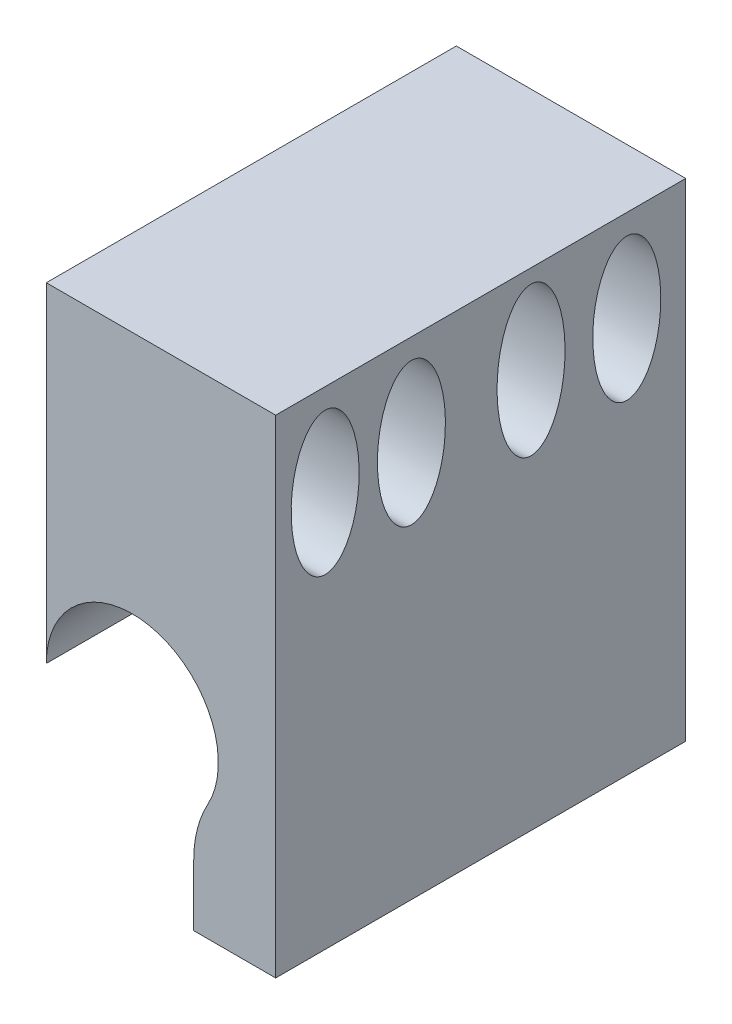
ISO-10303-21;
HEADER;
FILE_DESCRIPTION(('STEP AP214'),'2;1');
FILE_NAME('part.step','',(''),(''),'','','');
FILE_SCHEMA(('AUTOMOTIVE_DESIGN { 1 0 10303 214 1 1 1 1 }'));
ENDSEC;
DATA;
#1=APPLICATION_CONTEXT('core data for automotive mechanical design processes');
#2=APPLICATION_PROTOCOL_DEFINITION('international standard','automotive_design',2000,#1);
#3=PRODUCT_CONTEXT('',#1,'mechanical');
#4=PRODUCT('Part','Part','',(#3));
#5=PRODUCT_RELATED_PRODUCT_CATEGORY('part','',(#4));
#6=PRODUCT_DEFINITION_FORMATION('','',#4);
#7=PRODUCT_DEFINITION_CONTEXT('part definition',#1,'design');
#8=PRODUCT_DEFINITION('design','',#6,#7);
#9=PRODUCT_DEFINITION_SHAPE('','',#8);
#10=(LENGTH_UNIT() NAMED_UNIT(*) SI_UNIT(.MILLI.,.METRE.));
#11=(NAMED_UNIT(*) PLANE_ANGLE_UNIT() SI_UNIT($,.RADIAN.));
#12=(NAMED_UNIT(*) SI_UNIT($,.STERADIAN.) SOLID_ANGLE_UNIT());
#13=UNCERTAINTY_MEASURE_WITH_UNIT(LENGTH_MEASURE(1.E-05),#10,'distance_accuracy_value','');
#14=(GEOMETRIC_REPRESENTATION_CONTEXT(3) GLOBAL_UNCERTAINTY_ASSIGNED_CONTEXT((#13)) GLOBAL_UNIT_ASSIGNED_CONTEXT((#10,
#11,#12)) REPRESENTATION_CONTEXT('',''));
#15=CARTESIAN_POINT('',(0.,0.,0.));
#16=DIRECTION('',(0.,0.,1.));
#17=DIRECTION('',(1.,0.,0.));
#18=AXIS2_PLACEMENT_3D('',#15,#16,#17);
#19=CARTESIAN_POINT('',(0.,0.,28.6));
#20=DIRECTION('',(1.,0.,0.));
#21=DIRECTION('',(0.,1.,0.));
#22=AXIS2_PLACEMENT_3D('',#19,#20,#21);
#23=PLANE('',#22);
#24=CARTESIAN_POINT('',(0.,-6.17224659471775,10.7859357589348));
#25=DIRECTION('',(-1.,0.,0.));
#26=DIRECTION('',(0.,-1.,0.));
#27=AXIS2_PLACEMENT_3D('',#24,#25,#26);
#28=ELLIPSE('',#27,5.18327130557119,2.37200551271902);
#29=CARTESIAN_POINT('',(0.,-11.3555179002889,10.7859357589348));
#30=VERTEX_POINT('',#29);
#31=EDGE_CURVE('E230',#30,#30,#28,.F.);
#32=ORIENTED_EDGE('',*,*,#31,.T.);
#33=EDGE_LOOP('',(#32));
#34=FACE_BOUND('',#33,.T.);
#35=CARTESIAN_POINT('',(0.,-6.39187673478433,19.1318810814647));
#36=DIRECTION('',(-1.,0.,0.));
#37=DIRECTION('',(0.,-1.,0.));
#38=AXIS2_PLACEMENT_3D('',#35,#36,#37);
#39=ELLIPSE('',#38,4.96364116550461,2.37200551271902);
#40=CARTESIAN_POINT('',(0.,-11.3555179002889,19.1318810814647));
#41=VERTEX_POINT('',#40);
#42=EDGE_CURVE('E239',#41,#41,#39,.F.);
#43=ORIENTED_EDGE('',*,*,#42,.T.);
#44=EDGE_LOOP('',(#43));
#45=FACE_BOUND('',#44,.T.);
#46=CARTESIAN_POINT('',(0.,-6.39187673478433,25.1497469192889));
#47=DIRECTION('',(-1.,0.,0.));
#48=DIRECTION('',(0.,-1.,0.));
#49=AXIS2_PLACEMENT_3D('',#46,#47,#48);
#50=ELLIPSE('',#49,4.96364116550461,2.37200551271902);
#51=CARTESIAN_POINT('',(0.,-11.3555179002889,25.1497469192889));
#52=VERTEX_POINT('',#51);
#53=EDGE_CURVE('E242',#52,#52,#50,.F.);
#54=ORIENTED_EDGE('',*,*,#53,.T.);
#55=EDGE_LOOP('',(#54));
#56=FACE_BOUND('',#55,.T.);
#57=CARTESIAN_POINT('',(0.,-6.39187673478433,4.10917950091088));
#58=DIRECTION('',(-1.,0.,0.));
#59=DIRECTION('',(0.,-1.,0.));
#60=AXIS2_PLACEMENT_3D('',#57,#58,#59);
#61=ELLIPSE('',#60,4.96364116550461,2.37200551271902);
#62=CARTESIAN_POINT('',(0.,-11.3555179002889,4.10917950091088));
#63=VERTEX_POINT('',#62);
#64=EDGE_CURVE('E126',#63,#63,#61,.F.);
#65=ORIENTED_EDGE('',*,*,#64,.T.);
#66=EDGE_LOOP('',(#65));
#67=FACE_BOUND('',#66,.T.);
#68=DIRECTION('',(0.,-1.,0.));
#69=VECTOR('',#68,1.);
#70=CARTESIAN_POINT('',(0.,0.,0.));
#71=LINE('',#70,#69);
#72=CARTESIAN_POINT('',(0.,0.,0.));
#73=VERTEX_POINT('',#72);
#74=CARTESIAN_POINT('',(0.,-23.,0.));
#75=VERTEX_POINT('',#74);
#76=EDGE_CURVE('E124',#73,#75,#71,.T.);
#77=ORIENTED_EDGE('',*,*,#76,.T.);
#78=DIRECTION('',(0.,0.,1.));
#79=VECTOR('',#78,1.);
#80=CARTESIAN_POINT('',(0.,-23.,0.));
#81=LINE('',#80,#79);
#82=CARTESIAN_POINT('',(0.,-23.,28.6));
#83=VERTEX_POINT('',#82);
#84=EDGE_CURVE('E56',#75,#83,#81,.T.);
#85=ORIENTED_EDGE('',*,*,#84,.T.);
#86=DIRECTION('',(0.,-1.,0.));
#87=VECTOR('',#86,1.);
#88=CARTESIAN_POINT('',(0.,0.,28.6));
#89=LINE('',#88,#87);
#90=CARTESIAN_POINT('',(0.,0.,28.6));
#91=VERTEX_POINT('',#90);
#92=EDGE_CURVE('E115',#91,#83,#89,.T.);
#93=ORIENTED_EDGE('',*,*,#92,.F.);
#94=DIRECTION('',(0.,0.,-1.));
#95=VECTOR('',#94,1.);
#96=CARTESIAN_POINT('',(0.,0.,28.6));
#97=LINE('',#96,#95);
#98=EDGE_CURVE('E128',#91,#73,#97,.T.);
#99=ORIENTED_EDGE('',*,*,#98,.T.);
#100=EDGE_LOOP('',(#77,#85,#93,#99));
#101=FACE_BOUND('',#100,.T.);
#102=ADVANCED_FACE('F39',(#34,#45,#56,#67,#101),#23,.F.);
#103=CARTESIAN_POINT('',(0.,-34.,28.6));
#104=DIRECTION('',(0.,1.,0.));
#105=DIRECTION('',(0.,0.,1.));
#106=AXIS2_PLACEMENT_3D('',#103,#104,#105);
#107=PLANE('',#106);
#108=DIRECTION('',(1.,0.,0.));
#109=VECTOR('',#108,1.);
#110=CARTESIAN_POINT('',(0.,-34.,28.6));
#111=LINE('',#110,#109);
#112=CARTESIAN_POINT('',(10.284151777169,-34.,28.6));
#113=VERTEX_POINT('',#112);
#114=CARTESIAN_POINT('',(16.,-34.,28.6));
#115=VERTEX_POINT('',#114);
#116=EDGE_CURVE('E154',#113,#115,#111,.T.);
#117=ORIENTED_EDGE('',*,*,#116,.F.);
#118=DIRECTION('',(0.,0.,1.));
#119=VECTOR('',#118,1.);
#120=CARTESIAN_POINT('',(10.284151777169,-34.,0.));
#121=LINE('',#120,#119);
#122=CARTESIAN_POINT('',(10.284151777169,-34.,0.));
#123=VERTEX_POINT('',#122);
#124=EDGE_CURVE('E161',#123,#113,#121,.T.);
#125=ORIENTED_EDGE('',*,*,#124,.F.);
#126=DIRECTION('',(1.,0.,0.));
#127=VECTOR('',#126,1.);
#128=CARTESIAN_POINT('',(0.,-34.,0.));
#129=LINE('',#128,#127);
#130=CARTESIAN_POINT('',(16.,-34.,0.));
#131=VERTEX_POINT('',#130);
#132=EDGE_CURVE('E133',#123,#131,#129,.T.);
#133=ORIENTED_EDGE('',*,*,#132,.T.);
#134=DIRECTION('',(0.,0.,-1.));
#135=VECTOR('',#134,1.);
#136=CARTESIAN_POINT('',(16.,-34.,28.6));
#137=LINE('',#136,#135);
#138=EDGE_CURVE('E146',#115,#131,#137,.T.);
#139=ORIENTED_EDGE('',*,*,#138,.F.);
#140=EDGE_LOOP('',(#117,#125,#133,#139));
#141=FACE_BOUND('',#140,.T.);
#142=ADVANCED_FACE('F181',(#141),#107,.F.);
#143=CARTESIAN_POINT('',(16.,0.,28.6));
#144=DIRECTION('',(-1.,0.,0.));
#145=DIRECTION('',(0.,-1.,0.));
#146=AXIS2_PLACEMENT_3D('',#143,#144,#145);
#147=PLANE('',#146);
#148=CARTESIAN_POINT('',(16.,-6.17224659471775,10.7859357589348));
#149=DIRECTION('',(-1.,0.,0.));
#150=DIRECTION('',(0.,-1.,0.));
#151=AXIS2_PLACEMENT_3D('',#148,#149,#150);
#152=ELLIPSE('',#151,5.18327130557119,2.37200551271902);
#153=CARTESIAN_POINT('',(16.,-11.3555179002889,10.7859357589348));
#154=VERTEX_POINT('',#153);
#155=EDGE_CURVE('E245',#154,#154,#152,.T.);
#156=ORIENTED_EDGE('',*,*,#155,.T.);
#157=EDGE_LOOP('',(#156));
#158=FACE_BOUND('',#157,.T.);
#159=CARTESIAN_POINT('',(16.,-6.39187673478433,19.1318810814647));
#160=DIRECTION('',(-1.,0.,0.));
#161=DIRECTION('',(0.,-1.,0.));
#162=AXIS2_PLACEMENT_3D('',#159,#160,#161);
#163=ELLIPSE('',#162,4.96364116550461,2.37200551271902);
#164=CARTESIAN_POINT('',(16.,-11.3555179002889,19.1318810814647));
#165=VERTEX_POINT('',#164);
#166=EDGE_CURVE('E249',#165,#165,#163,.T.);
#167=ORIENTED_EDGE('',*,*,#166,.T.);
#168=EDGE_LOOP('',(#167));
#169=FACE_BOUND('',#168,.T.);
#170=CARTESIAN_POINT('',(16.,-6.39187673478433,25.1497469192889));
#171=DIRECTION('',(-1.,0.,0.));
#172=DIRECTION('',(0.,-1.,0.));
#173=AXIS2_PLACEMENT_3D('',#170,#171,#172);
#174=ELLIPSE('',#173,4.96364116550461,2.37200551271902);
#175=CARTESIAN_POINT('',(16.,-11.3555179002889,25.1497469192889));
#176=VERTEX_POINT('',#175);
#177=EDGE_CURVE('E253',#176,#176,#174,.T.);
#178=ORIENTED_EDGE('',*,*,#177,.T.);
#179=EDGE_LOOP('',(#178));
#180=FACE_BOUND('',#179,.T.);
#181=CARTESIAN_POINT('',(16.,-6.39187673478433,4.10917950091088));
#182=DIRECTION('',(-1.,0.,0.));
#183=DIRECTION('',(0.,-1.,0.));
#184=AXIS2_PLACEMENT_3D('',#181,#182,#183);
#185=ELLIPSE('',#184,4.96364116550461,2.37200551271902);
#186=CARTESIAN_POINT('',(16.,-11.3555179002889,4.10917950091088));
#187=VERTEX_POINT('',#186);
#188=EDGE_CURVE('E224',#187,#187,#185,.T.);
#189=ORIENTED_EDGE('',*,*,#188,.T.);
#190=EDGE_LOOP('',(#189));
#191=FACE_BOUND('',#190,.T.);
#192=DIRECTION('',(0.,1.,0.));
#193=VECTOR('',#192,1.);
#194=CARTESIAN_POINT('',(16.,0.,0.));
#195=LINE('',#194,#193);
#196=CARTESIAN_POINT('',(16.,0.,0.));
#197=VERTEX_POINT('',#196);
#198=EDGE_CURVE('E137',#131,#197,#195,.T.);
#199=ORIENTED_EDGE('',*,*,#198,.T.);
#200=DIRECTION('',(0.,0.,-1.));
#201=VECTOR('',#200,1.);
#202=CARTESIAN_POINT('',(16.,0.,28.6));
#203=LINE('',#202,#201);
#204=CARTESIAN_POINT('',(16.,0.,28.6));
#205=VERTEX_POINT('',#204);
#206=EDGE_CURVE('E141',#205,#197,#203,.T.);
#207=ORIENTED_EDGE('',*,*,#206,.F.);
#208=DIRECTION('',(0.,1.,0.));
#209=VECTOR('',#208,1.);
#210=CARTESIAN_POINT('',(16.,0.,28.6));
#211=LINE('',#210,#209);
#212=EDGE_CURVE('E151',#115,#205,#211,.T.);
#213=ORIENTED_EDGE('',*,*,#212,.F.);
#214=ORIENTED_EDGE('',*,*,#138,.T.);
#215=EDGE_LOOP('',(#199,#207,#213,#214));
#216=FACE_BOUND('',#215,.T.);
#217=ADVANCED_FACE('F188',(#158,#169,#180,#191,#216),#147,.F.);
#218=CARTESIAN_POINT('',(0.,0.,28.6));
#219=DIRECTION('',(0.,-1.,0.));
#220=DIRECTION('',(0.,0.,-1.));
#221=AXIS2_PLACEMENT_3D('',#218,#219,#220);
#222=PLANE('',#221);
#223=DIRECTION('',(-1.,0.,0.));
#224=VECTOR('',#223,1.);
#225=CARTESIAN_POINT('',(0.,0.,0.));
#226=LINE('',#225,#224);
#227=EDGE_CURVE('E143',#197,#73,#226,.T.);
#228=ORIENTED_EDGE('',*,*,#227,.T.);
#229=ORIENTED_EDGE('',*,*,#98,.F.);
#230=DIRECTION('',(-1.,0.,0.));
#231=VECTOR('',#230,1.);
#232=CARTESIAN_POINT('',(0.,0.,28.6));
#233=LINE('',#232,#231);
#234=EDGE_CURVE('E119',#205,#91,#233,.T.);
#235=ORIENTED_EDGE('',*,*,#234,.F.);
#236=ORIENTED_EDGE('',*,*,#206,.T.);
#237=EDGE_LOOP('',(#228,#229,#235,#236));
#238=FACE_BOUND('',#237,.T.);
#239=ADVANCED_FACE('F192',(#238),#222,.F.);
#240=CARTESIAN_POINT('',(0.,0.,28.6));
#241=DIRECTION('',(0.,0.,1.));
#242=DIRECTION('',(1.,0.,0.));
#243=AXIS2_PLACEMENT_3D('',#240,#241,#242);
#244=PLANE('',#243);
#245=CARTESIAN_POINT('',(6.,-23.,28.6));
#246=DIRECTION('',(0.,0.,1.));
#247=DIRECTION('',(1.,0.,0.));
#248=AXIS2_PLACEMENT_3D('',#245,#246,#247);
#249=CIRCLE('',#248,6.);
#250=CARTESIAN_POINT('',(11.2646364759296,-25.8781248715634,28.6));
#251=VERTEX_POINT('',#250);
#252=EDGE_CURVE('E11',#251,#83,#249,.T.);
#253=ORIENTED_EDGE('',*,*,#252,.F.);
#254=CARTESIAN_POINT('',(18.284151777169,-29.7156247003146,28.6));
#255=DIRECTION('',(0.,0.,1.));
#256=DIRECTION('',(1.,0.,0.));
#257=AXIS2_PLACEMENT_3D('',#254,#255,#256);
#258=CIRCLE('',#257,8.);
#259=CARTESIAN_POINT('',(10.284151777169,-29.7156247003146,28.600006));
#260=VERTEX_POINT('',#259);
#261=EDGE_CURVE('E99',#260,#251,#258,.F.);
#262=ORIENTED_EDGE('',*,*,#261,.F.);
#263=DIRECTION('',(0.,1.,0.));
#264=VECTOR('',#263,1.);
#265=CARTESIAN_POINT('',(10.284151777169,0.,28.6));
#266=LINE('',#265,#264);
#267=EDGE_CURVE('E164',#113,#260,#266,.T.);
#268=ORIENTED_EDGE('',*,*,#267,.F.);
#269=ORIENTED_EDGE('',*,*,#116,.T.);
#270=ORIENTED_EDGE('',*,*,#212,.T.);
#271=ORIENTED_EDGE('',*,*,#234,.T.);
#272=ORIENTED_EDGE('',*,*,#92,.T.);
#273=EDGE_LOOP('',(#253,#262,#268,#269,#270,#271,#272));
#274=FACE_BOUND('',#273,.T.);
#275=ADVANCED_FACE('F179',(#274),#244,.T.);
#276=CARTESIAN_POINT('',(0.,0.,0.));
#277=DIRECTION('',(0.,0.,1.));
#278=DIRECTION('',(1.,0.,0.));
#279=AXIS2_PLACEMENT_3D('',#276,#277,#278);
#280=PLANE('',#279);
#281=CARTESIAN_POINT('',(18.284151777169,-29.7156247003146,0.));
#282=DIRECTION('',(0.,0.,-1.));
#283=DIRECTION('',(-1.,0.,0.));
#284=AXIS2_PLACEMENT_3D('',#281,#282,#283);
#285=CIRCLE('',#284,8.);
#286=CARTESIAN_POINT('',(10.284151777169,-29.7156247003146,0.));
#287=VERTEX_POINT('',#286);
#288=CARTESIAN_POINT('',(11.2646364759296,-25.8781248715634,0.));
#289=VERTEX_POINT('',#288);
#290=EDGE_CURVE('E96',#287,#289,#285,.T.);
#291=ORIENTED_EDGE('',*,*,#290,.T.);
#292=CARTESIAN_POINT('',(6.,-23.,0.));
#293=DIRECTION('',(0.,0.,1.));
#294=DIRECTION('',(1.,0.,0.));
#295=AXIS2_PLACEMENT_3D('',#292,#293,#294);
#296=CIRCLE('',#295,6.);
#297=EDGE_CURVE('E105',#289,#75,#296,.T.);
#298=ORIENTED_EDGE('',*,*,#297,.T.);
#299=ORIENTED_EDGE('',*,*,#76,.F.);
#300=ORIENTED_EDGE('',*,*,#227,.F.);
#301=ORIENTED_EDGE('',*,*,#198,.F.);
#302=ORIENTED_EDGE('',*,*,#132,.F.);
#303=DIRECTION('',(0.,1.,0.));
#304=VECTOR('',#303,1.);
#305=CARTESIAN_POINT('',(10.284151777169,-34.,0.));
#306=LINE('',#305,#304);
#307=EDGE_CURVE('E109',#123,#287,#306,.T.);
#308=ORIENTED_EDGE('',*,*,#307,.T.);
#309=EDGE_LOOP('',(#291,#298,#299,#300,#301,#302,#308));
#310=FACE_BOUND('',#309,.T.);
#311=ADVANCED_FACE('F112',(#310),#280,.F.);
#312=CARTESIAN_POINT('',(10.284151777169,-34.,0.));
#313=DIRECTION('',(1.,0.,0.));
#314=DIRECTION('',(0.,0.,-1.));
#315=AXIS2_PLACEMENT_3D('',#312,#313,#314);
#316=PLANE('',#315);
#317=ORIENTED_EDGE('',*,*,#267,.T.);
#318=DIRECTION('',(0.,0.,1.));
#319=VECTOR('',#318,1.);
#320=CARTESIAN_POINT('',(10.284151777169,-29.7156247003146,0.));
#321=LINE('',#320,#319);
#322=EDGE_CURVE('E102',#287,#260,#321,.T.);
#323=ORIENTED_EDGE('',*,*,#322,.F.);
#324=ORIENTED_EDGE('',*,*,#307,.F.);
#325=ORIENTED_EDGE('',*,*,#124,.T.);
#326=EDGE_LOOP('',(#317,#323,#324,#325));
#327=FACE_BOUND('',#326,.T.);
#328=ADVANCED_FACE('F175',(#327),#316,.F.);
#329=CARTESIAN_POINT('',(18.284151777169,-29.7156247003146,0.));
#330=DIRECTION('',(0.,0.,1.));
#331=DIRECTION('',(1.,0.,0.));
#332=AXIS2_PLACEMENT_3D('',#329,#330,#331);
#333=CYLINDRICAL_SURFACE('',#332,8.);
#334=ORIENTED_EDGE('',*,*,#261,.T.);
#335=DIRECTION('',(0.,0.,1.));
#336=VECTOR('',#335,1.);
#337=CARTESIAN_POINT('',(11.2646364759296,-25.8781248715634,0.));
#338=LINE('',#337,#336);
#339=EDGE_CURVE('E49',#289,#251,#338,.T.);
#340=ORIENTED_EDGE('',*,*,#339,.F.);
#341=ORIENTED_EDGE('',*,*,#290,.F.);
#342=ORIENTED_EDGE('',*,*,#322,.T.);
#343=EDGE_LOOP('',(#334,#340,#341,#342));
#344=FACE_BOUND('',#343,.T.);
#345=ADVANCED_FACE('F93',(#344),#333,.T.);
#346=CARTESIAN_POINT('',(6.,-23.,0.));
#347=DIRECTION('',(0.,0.,1.));
#348=DIRECTION('',(1.,0.,0.));
#349=AXIS2_PLACEMENT_3D('',#346,#347,#348);
#350=CYLINDRICAL_SURFACE('',#349,6.);
#351=ORIENTED_EDGE('',*,*,#297,.F.);
#352=ORIENTED_EDGE('',*,*,#339,.T.);
#353=ORIENTED_EDGE('',*,*,#252,.T.);
#354=ORIENTED_EDGE('',*,*,#84,.F.);
#355=EDGE_LOOP('',(#351,#352,#353,#354));
#356=FACE_BOUND('',#355,.T.);
#357=ADVANCED_FACE('F41',(#356),#350,.F.);
#358=DIRECTION('',(-1.,0.,0.));
#359=VECTOR('',#358,1.);
#360=SURFACE_OF_LINEAR_EXTRUSION('',#185,#359);
#361=ORIENTED_EDGE('',*,*,#188,.F.);
#362=EDGE_LOOP('',(#361));
#363=FACE_BOUND('',#362,.T.);
#364=ORIENTED_EDGE('',*,*,#64,.F.);
#365=EDGE_LOOP('',(#364));
#366=FACE_BOUND('',#365,.T.);
#367=ADVANCED_FACE('F216',(#363,#366),#360,.F.);
#368=DIRECTION('',(-1.,0.,0.));
#369=VECTOR('',#368,1.);
#370=SURFACE_OF_LINEAR_EXTRUSION('',#174,#369);
#371=ORIENTED_EDGE('',*,*,#177,.F.);
#372=EDGE_LOOP('',(#371));
#373=FACE_BOUND('',#372,.T.);
#374=ORIENTED_EDGE('',*,*,#53,.F.);
#375=EDGE_LOOP('',(#374));
#376=FACE_BOUND('',#375,.T.);
#377=ADVANCED_FACE('F220',(#373,#376),#370,.F.);
#378=DIRECTION('',(-1.,0.,0.));
#379=VECTOR('',#378,1.);
#380=SURFACE_OF_LINEAR_EXTRUSION('',#163,#379);
#381=ORIENTED_EDGE('',*,*,#166,.F.);
#382=EDGE_LOOP('',(#381));
#383=FACE_BOUND('',#382,.T.);
#384=ORIENTED_EDGE('',*,*,#42,.F.);
#385=EDGE_LOOP('',(#384));
#386=FACE_BOUND('',#385,.T.);
#387=ADVANCED_FACE('F261',(#383,#386),#380,.F.);
#388=DIRECTION('',(-1.,0.,0.));
#389=VECTOR('',#388,1.);
#390=SURFACE_OF_LINEAR_EXTRUSION('',#152,#389);
#391=ORIENTED_EDGE('',*,*,#155,.F.);
#392=EDGE_LOOP('',(#391));
#393=FACE_BOUND('',#392,.T.);
#394=ORIENTED_EDGE('',*,*,#31,.F.);
#395=EDGE_LOOP('',(#394));
#396=FACE_BOUND('',#395,.T.);
#397=ADVANCED_FACE('F264',(#393,#396),#390,.F.);
#398=CLOSED_SHELL('',(#102,#142,#217,#239,#275,#311,#328,#345,#357,#367,#377,#387,#397));
#399=MANIFOLD_SOLID_BREP('B2',#398);
#400=ADVANCED_BREP_SHAPE_REPRESENTATION('',(#18,#399),#14);
#401=SHAPE_DEFINITION_REPRESENTATION(#9,#400);
ENDSEC;
END-ISO-10303-21;
